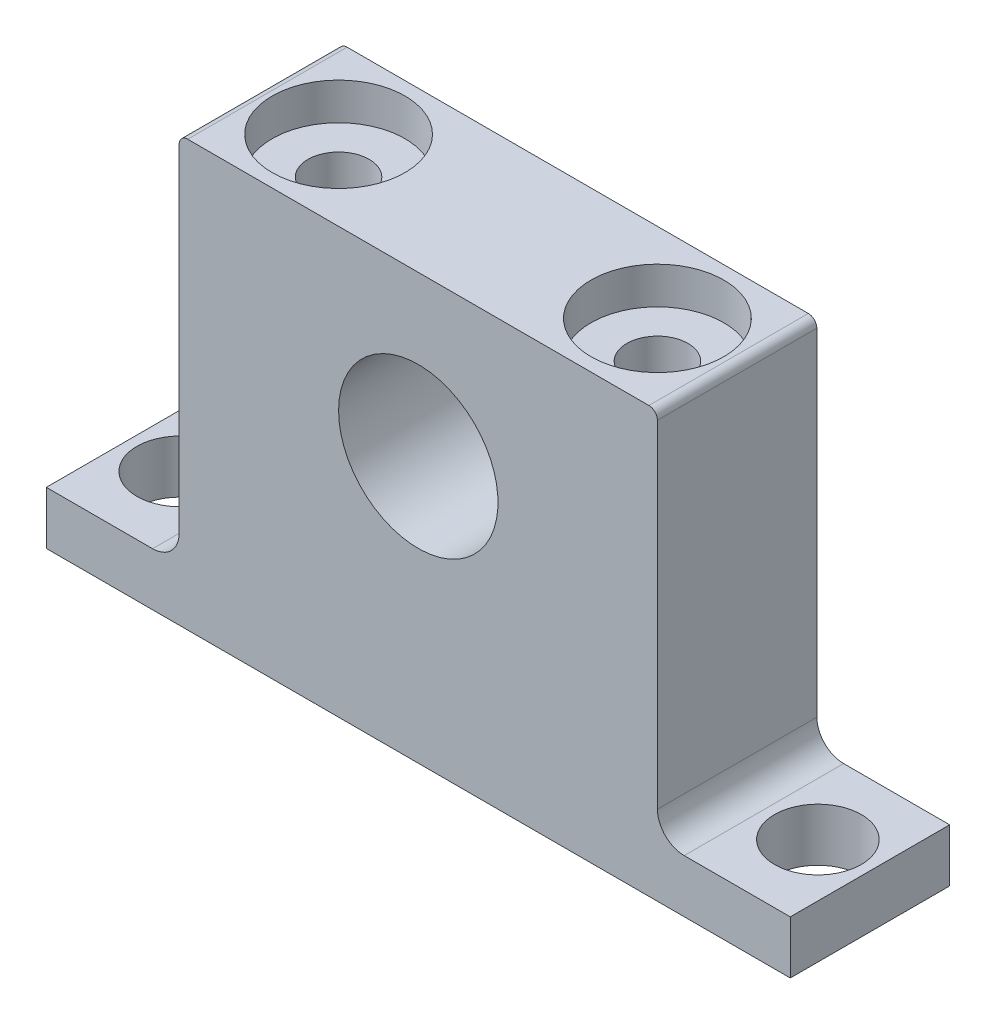
ISO-10303-21;
HEADER;
FILE_DESCRIPTION(('STEP AP214'),'2;1');
FILE_NAME('part.step','',(''),(''),'','','');
FILE_SCHEMA(('AUTOMOTIVE_DESIGN { 1 0 10303 214 1 1 1 1 }'));
ENDSEC;
DATA;
#1=APPLICATION_CONTEXT('core data for automotive mechanical design processes');
#2=APPLICATION_PROTOCOL_DEFINITION('international standard','automotive_design',2000,#1);
#3=PRODUCT_CONTEXT('',#1,'mechanical');
#4=PRODUCT('Part','Part','',(#3));
#5=PRODUCT_RELATED_PRODUCT_CATEGORY('part','',(#4));
#6=PRODUCT_DEFINITION_FORMATION('','',#4);
#7=PRODUCT_DEFINITION_CONTEXT('part definition',#1,'design');
#8=PRODUCT_DEFINITION('design','',#6,#7);
#9=PRODUCT_DEFINITION_SHAPE('','',#8);
#10=(LENGTH_UNIT() NAMED_UNIT(*) SI_UNIT(.MILLI.,.METRE.));
#11=(NAMED_UNIT(*) PLANE_ANGLE_UNIT() SI_UNIT($,.RADIAN.));
#12=(NAMED_UNIT(*) SI_UNIT($,.STERADIAN.) SOLID_ANGLE_UNIT());
#13=UNCERTAINTY_MEASURE_WITH_UNIT(LENGTH_MEASURE(1.E-05),#10,'distance_accuracy_value','');
#14=(GEOMETRIC_REPRESENTATION_CONTEXT(3) GLOBAL_UNCERTAINTY_ASSIGNED_CONTEXT((#13)) GLOBAL_UNIT_ASSIGNED_CONTEXT((#10,
#11,#12)) REPRESENTATION_CONTEXT('',''));
#15=CARTESIAN_POINT('',(0.,0.,0.));
#16=DIRECTION('',(0.,0.,1.));
#17=DIRECTION('',(1.,0.,0.));
#18=AXIS2_PLACEMENT_3D('',#15,#16,#17);
#19=CARTESIAN_POINT('',(-15.875,-7.94816958418083,9.525));
#20=DIRECTION('',(0.,0.,1.));
#21=DIRECTION('',(1.,0.,0.));
#22=AXIS2_PLACEMENT_3D('',#19,#20,#21);
#23=PLANE('',#22);
#24=CARTESIAN_POINT('',(-15.875,-7.94816958418083,9.525));
#25=DIRECTION('',(0.,0.,1.));
#26=DIRECTION('',(1.,0.,0.));
#27=AXIS2_PLACEMENT_3D('',#24,#25,#26);
#28=CIRCLE('',#27,1.5875);
#29=CARTESIAN_POINT('',(-15.875,-9.53566958418083,9.525));
#30=VERTEX_POINT('',#29);
#31=CARTESIAN_POINT('',(-14.2875,-7.94816958418082,9.525));
#32=VERTEX_POINT('',#31);
#33=EDGE_CURVE('E230',#30,#32,#28,.T.);
#34=ORIENTED_EDGE('',*,*,#33,.F.);
#35=DIRECTION('',(1.,0.,0.));
#36=VECTOR('',#35,1.);
#37=CARTESIAN_POINT('',(-22.225,-9.53566958418083,9.525));
#38=LINE('',#37,#36);
#39=CARTESIAN_POINT('',(-22.225,-9.53566958418083,9.525));
#40=VERTEX_POINT('',#39);
#41=EDGE_CURVE('E192',#40,#30,#38,.T.);
#42=ORIENTED_EDGE('',*,*,#41,.F.);
#43=DIRECTION('',(0.,1.,0.));
#44=VECTOR('',#43,1.);
#45=CARTESIAN_POINT('',(-22.225,-12.7,9.525));
#46=LINE('',#45,#44);
#47=CARTESIAN_POINT('',(-22.225,-12.7,9.525));
#48=VERTEX_POINT('',#47);
#49=EDGE_CURVE('E179',#48,#40,#46,.T.);
#50=ORIENTED_EDGE('',*,*,#49,.F.);
#51=DIRECTION('',(-1.,0.,0.));
#52=VECTOR('',#51,1.);
#53=CARTESIAN_POINT('',(22.225,-12.7,9.525));
#54=LINE('',#53,#52);
#55=CARTESIAN_POINT('',(22.225,-12.7,9.525));
#56=VERTEX_POINT('',#55);
#57=EDGE_CURVE('E191',#56,#48,#54,.T.);
#58=ORIENTED_EDGE('',*,*,#57,.F.);
#59=DIRECTION('',(0.,1.,0.));
#60=VECTOR('',#59,1.);
#61=CARTESIAN_POINT('',(22.225,-12.7,9.525));
#62=LINE('',#61,#60);
#63=CARTESIAN_POINT('',(22.225,-9.53566958418083,9.525));
#64=VERTEX_POINT('',#63);
#65=EDGE_CURVE('E196',#56,#64,#62,.T.);
#66=ORIENTED_EDGE('',*,*,#65,.T.);
#67=DIRECTION('',(-1.,0.,0.));
#68=VECTOR('',#67,1.);
#69=CARTESIAN_POINT('',(22.225,-9.53566958418083,9.525));
#70=LINE('',#69,#68);
#71=CARTESIAN_POINT('',(15.888767669028,-9.53566958418083,9.525));
#72=VERTEX_POINT('',#71);
#73=EDGE_CURVE('E198',#64,#72,#70,.T.);
#74=ORIENTED_EDGE('',*,*,#73,.T.);
#75=CARTESIAN_POINT('',(15.888767669028,-7.93440191515283,9.525));
#76=DIRECTION('',(0.,0.,-1.));
#77=DIRECTION('',(-1.,0.,0.));
#78=AXIS2_PLACEMENT_3D('',#75,#76,#77);
#79=CIRCLE('',#78,1.601267669028);
#80=CARTESIAN_POINT('',(14.2875,-7.93440191515282,9.525));
#81=VERTEX_POINT('',#80);
#82=EDGE_CURVE('E376',#72,#81,#79,.T.);
#83=ORIENTED_EDGE('',*,*,#82,.T.);
#84=DIRECTION('',(0.,1.,0.));
#85=VECTOR('',#84,1.);
#86=CARTESIAN_POINT('',(14.2875,3.175,9.525));
#87=LINE('',#86,#85);
#88=CARTESIAN_POINT('',(14.2875,12.192,9.525));
#89=VERTEX_POINT('',#88);
#90=EDGE_CURVE('E374',#81,#89,#87,.T.);
#91=ORIENTED_EDGE('',*,*,#90,.T.);
#92=CARTESIAN_POINT('',(13.7795,12.192,9.525));
#93=DIRECTION('',(0.,0.,1.));
#94=DIRECTION('',(1.,0.,0.));
#95=AXIS2_PLACEMENT_3D('',#92,#93,#94);
#96=CIRCLE('',#95,0.508);
#97=CARTESIAN_POINT('',(13.7795,12.7,9.525));
#98=VERTEX_POINT('',#97);
#99=EDGE_CURVE('E372',#89,#98,#96,.T.);
#100=ORIENTED_EDGE('',*,*,#99,.T.);
#101=DIRECTION('',(-1.,0.,0.));
#102=VECTOR('',#101,1.);
#103=CARTESIAN_POINT('',(13.7795,12.7,9.525));
#104=LINE('',#103,#102);
#105=CARTESIAN_POINT('',(-13.7795,12.7,9.525));
#106=VERTEX_POINT('',#105);
#107=EDGE_CURVE('E370',#98,#106,#104,.T.);
#108=ORIENTED_EDGE('',*,*,#107,.T.);
#109=CARTESIAN_POINT('',(-13.7795,12.192,9.525));
#110=DIRECTION('',(0.,0.,1.));
#111=DIRECTION('',(1.,0.,0.));
#112=AXIS2_PLACEMENT_3D('',#109,#110,#111);
#113=CIRCLE('',#112,0.508);
#114=CARTESIAN_POINT('',(-14.2875,12.192,9.525));
#115=VERTEX_POINT('',#114);
#116=EDGE_CURVE('E367',#106,#115,#113,.T.);
#117=ORIENTED_EDGE('',*,*,#116,.T.);
#118=DIRECTION('',(0.,1.,0.));
#119=VECTOR('',#118,1.);
#120=CARTESIAN_POINT('',(-14.2875,-7.94816958418082,9.525));
#121=LINE('',#120,#119);
#122=EDGE_CURVE('E365',#32,#115,#121,.T.);
#123=ORIENTED_EDGE('',*,*,#122,.F.);
#124=EDGE_LOOP('',(#34,#42,#50,#58,#66,#74,#83,#91,#100,#108,#117,#123));
#125=FACE_BOUND('',#124,.T.);
#126=CARTESIAN_POINT('',(0.,3.175,9.525));
#127=DIRECTION('',(0.,0.,1.));
#128=DIRECTION('',(1.,0.,0.));
#129=AXIS2_PLACEMENT_3D('',#126,#127,#128);
#130=CIRCLE('',#129,4.7625);
#131=CARTESIAN_POINT('',(-4.76250000000002,3.175,9.525));
#132=VERTEX_POINT('',#131);
#133=EDGE_CURVE('E207',#132,#132,#130,.T.);
#134=ORIENTED_EDGE('',*,*,#133,.F.);
#135=EDGE_LOOP('',(#134));
#136=FACE_BOUND('',#135,.T.);
#137=ADVANCED_FACE('F80',(#125,#136),#23,.T.);
#138=CARTESIAN_POINT('',(-15.875,-7.94816958418083,0.));
#139=DIRECTION('',(0.,0.,1.));
#140=DIRECTION('',(1.,0.,0.));
#141=AXIS2_PLACEMENT_3D('',#138,#139,#140);
#142=PLANE('',#141);
#143=CARTESIAN_POINT('',(-15.875,-7.94816958418083,0.));
#144=DIRECTION('',(0.,0.,1.));
#145=DIRECTION('',(1.,0.,0.));
#146=AXIS2_PLACEMENT_3D('',#143,#144,#145);
#147=CIRCLE('',#146,1.5875);
#148=CARTESIAN_POINT('',(-15.875,-9.53566958418083,0.));
#149=VERTEX_POINT('',#148);
#150=CARTESIAN_POINT('',(-14.2875,-7.94816958418082,0.));
#151=VERTEX_POINT('',#150);
#152=EDGE_CURVE('E203',#149,#151,#147,.T.);
#153=ORIENTED_EDGE('',*,*,#152,.T.);
#154=DIRECTION('',(0.,1.,0.));
#155=VECTOR('',#154,1.);
#156=CARTESIAN_POINT('',(-14.2875,3.175,0.));
#157=LINE('',#156,#155);
#158=CARTESIAN_POINT('',(-14.2875,12.192,0.));
#159=VERTEX_POINT('',#158);
#160=EDGE_CURVE('E206',#151,#159,#157,.T.);
#161=ORIENTED_EDGE('',*,*,#160,.T.);
#162=CARTESIAN_POINT('',(-13.7795,12.192,0.));
#163=DIRECTION('',(0.,0.,1.));
#164=DIRECTION('',(1.,0.,0.));
#165=AXIS2_PLACEMENT_3D('',#162,#163,#164);
#166=CIRCLE('',#165,0.508);
#167=CARTESIAN_POINT('',(-13.7795,12.7,0.));
#168=VERTEX_POINT('',#167);
#169=EDGE_CURVE('E210',#168,#159,#166,.T.);
#170=ORIENTED_EDGE('',*,*,#169,.F.);
#171=DIRECTION('',(-1.,0.,0.));
#172=VECTOR('',#171,1.);
#173=CARTESIAN_POINT('',(13.7795,12.7,0.));
#174=LINE('',#173,#172);
#175=CARTESIAN_POINT('',(13.7795,12.7,0.));
#176=VERTEX_POINT('',#175);
#177=EDGE_CURVE('E213',#176,#168,#174,.T.);
#178=ORIENTED_EDGE('',*,*,#177,.F.);
#179=CARTESIAN_POINT('',(13.7795,12.192,0.));
#180=DIRECTION('',(0.,0.,1.));
#181=DIRECTION('',(1.,0.,0.));
#182=AXIS2_PLACEMENT_3D('',#179,#180,#181);
#183=CIRCLE('',#182,0.508);
#184=CARTESIAN_POINT('',(14.2875,12.192,0.));
#185=VERTEX_POINT('',#184);
#186=EDGE_CURVE('E215',#185,#176,#183,.T.);
#187=ORIENTED_EDGE('',*,*,#186,.F.);
#188=DIRECTION('',(0.,1.,0.));
#189=VECTOR('',#188,1.);
#190=CARTESIAN_POINT('',(14.2875,-7.93440191515282,0.));
#191=LINE('',#190,#189);
#192=CARTESIAN_POINT('',(14.2875,-7.93440191515282,0.));
#193=VERTEX_POINT('',#192);
#194=EDGE_CURVE('E217',#193,#185,#191,.T.);
#195=ORIENTED_EDGE('',*,*,#194,.F.);
#196=CARTESIAN_POINT('',(15.888767669028,-7.93440191515283,0.));
#197=DIRECTION('',(0.,0.,-1.));
#198=DIRECTION('',(-1.,0.,0.));
#199=AXIS2_PLACEMENT_3D('',#196,#197,#198);
#200=CIRCLE('',#199,1.601267669028);
#201=CARTESIAN_POINT('',(15.888767669028,-9.53566958418083,0.));
#202=VERTEX_POINT('',#201);
#203=EDGE_CURVE('E219',#202,#193,#200,.T.);
#204=ORIENTED_EDGE('',*,*,#203,.F.);
#205=DIRECTION('',(-1.,0.,0.));
#206=VECTOR('',#205,1.);
#207=CARTESIAN_POINT('',(22.225,-9.53566958418083,0.));
#208=LINE('',#207,#206);
#209=CARTESIAN_POINT('',(22.225,-9.53566958418083,0.));
#210=VERTEX_POINT('',#209);
#211=EDGE_CURVE('E221',#210,#202,#208,.T.);
#212=ORIENTED_EDGE('',*,*,#211,.F.);
#213=DIRECTION('',(0.,1.,0.));
#214=VECTOR('',#213,1.);
#215=CARTESIAN_POINT('',(22.225,-12.7,0.));
#216=LINE('',#215,#214);
#217=CARTESIAN_POINT('',(22.225,-12.7,0.));
#218=VERTEX_POINT('',#217);
#219=EDGE_CURVE('E223',#218,#210,#216,.T.);
#220=ORIENTED_EDGE('',*,*,#219,.F.);
#221=DIRECTION('',(-1.,0.,0.));
#222=VECTOR('',#221,1.);
#223=CARTESIAN_POINT('',(22.225,-12.7,0.));
#224=LINE('',#223,#222);
#225=CARTESIAN_POINT('',(-22.225,-12.7,0.));
#226=VERTEX_POINT('',#225);
#227=EDGE_CURVE('E225',#218,#226,#224,.T.);
#228=ORIENTED_EDGE('',*,*,#227,.T.);
#229=DIRECTION('',(0.,1.,0.));
#230=VECTOR('',#229,1.);
#231=CARTESIAN_POINT('',(-22.225,-12.7,0.));
#232=LINE('',#231,#230);
#233=CARTESIAN_POINT('',(-22.225,-9.53566958418083,0.));
#234=VERTEX_POINT('',#233);
#235=EDGE_CURVE('E181',#226,#234,#232,.T.);
#236=ORIENTED_EDGE('',*,*,#235,.T.);
#237=DIRECTION('',(1.,0.,0.));
#238=VECTOR('',#237,1.);
#239=CARTESIAN_POINT('',(-22.225,-9.53566958418083,0.));
#240=LINE('',#239,#238);
#241=EDGE_CURVE('E228',#234,#149,#240,.T.);
#242=ORIENTED_EDGE('',*,*,#241,.T.);
#243=EDGE_LOOP('',(#153,#161,#170,#178,#187,#195,#204,#212,#220,#228,#236,#242));
#244=FACE_BOUND('',#243,.T.);
#245=CARTESIAN_POINT('',(0.,3.175,0.));
#246=DIRECTION('',(0.,0.,1.));
#247=DIRECTION('',(1.,0.,0.));
#248=AXIS2_PLACEMENT_3D('',#245,#246,#247);
#249=CIRCLE('',#248,4.7625);
#250=CARTESIAN_POINT('',(-4.76250000000002,3.175,0.));
#251=VERTEX_POINT('',#250);
#252=EDGE_CURVE('E359',#251,#251,#249,.T.);
#253=ORIENTED_EDGE('',*,*,#252,.T.);
#254=EDGE_LOOP('',(#253));
#255=FACE_BOUND('',#254,.T.);
#256=ADVANCED_FACE('F254',(#244,#255),#142,.F.);
#257=CARTESIAN_POINT('',(-15.875,-7.94816958418083,9.525));
#258=DIRECTION('',(0.,0.,-1.));
#259=DIRECTION('',(-1.,0.,0.));
#260=AXIS2_PLACEMENT_3D('',#257,#258,#259);
#261=CYLINDRICAL_SURFACE('',#260,1.5875);
#262=ORIENTED_EDGE('',*,*,#152,.F.);
#263=DIRECTION('',(0.,0.,-1.));
#264=VECTOR('',#263,1.);
#265=CARTESIAN_POINT('',(-15.875,-9.53566958418083,9.525));
#266=LINE('',#265,#264);
#267=EDGE_CURVE('E12',#30,#149,#266,.T.);
#268=ORIENTED_EDGE('',*,*,#267,.F.);
#269=ORIENTED_EDGE('',*,*,#33,.T.);
#270=DIRECTION('',(0.,0.,-1.));
#271=VECTOR('',#270,1.);
#272=CARTESIAN_POINT('',(-14.2875,-7.94816958418082,9.525));
#273=LINE('',#272,#271);
#274=EDGE_CURVE('E84',#32,#151,#273,.T.);
#275=ORIENTED_EDGE('',*,*,#274,.T.);
#276=EDGE_LOOP('',(#262,#268,#269,#275));
#277=FACE_BOUND('',#276,.T.);
#278=ADVANCED_FACE('F82',(#277),#261,.F.);
#279=CARTESIAN_POINT('',(-22.225,-9.53566958418083,9.525));
#280=DIRECTION('',(0.,1.,0.));
#281=DIRECTION('',(0.,0.,1.));
#282=AXIS2_PLACEMENT_3D('',#279,#280,#281);
#283=PLANE('',#282);
#284=CARTESIAN_POINT('',(-19.05,-9.53566958418083,4.69901813767502));
#285=DIRECTION('',(0.,1.,0.));
#286=DIRECTION('',(0.,0.,1.));
#287=AXIS2_PLACEMENT_3D('',#284,#285,#286);
#288=CIRCLE('',#287,2.59079999999999);
#289=CARTESIAN_POINT('',(-19.05,-9.53566958418083,7.289818137675));
#290=VERTEX_POINT('',#289);
#291=EDGE_CURVE('E325',#290,#290,#288,.T.);
#292=ORIENTED_EDGE('',*,*,#291,.F.);
#293=EDGE_LOOP('',(#292));
#294=FACE_BOUND('',#293,.T.);
#295=ORIENTED_EDGE('',*,*,#241,.F.);
#296=DIRECTION('',(0.,0.,-1.));
#297=VECTOR('',#296,1.);
#298=CARTESIAN_POINT('',(-22.225,-9.53566958418083,9.525));
#299=LINE('',#298,#297);
#300=EDGE_CURVE('E90',#40,#234,#299,.T.);
#301=ORIENTED_EDGE('',*,*,#300,.F.);
#302=ORIENTED_EDGE('',*,*,#41,.T.);
#303=ORIENTED_EDGE('',*,*,#267,.T.);
#304=EDGE_LOOP('',(#295,#301,#302,#303));
#305=FACE_BOUND('',#304,.T.);
#306=ADVANCED_FACE('F257',(#294,#305),#283,.T.);
#307=CARTESIAN_POINT('',(-22.225,-12.7,9.525));
#308=DIRECTION('',(-1.,0.,0.));
#309=DIRECTION('',(0.,0.,1.));
#310=AXIS2_PLACEMENT_3D('',#307,#308,#309);
#311=PLANE('',#310);
#312=ORIENTED_EDGE('',*,*,#235,.F.);
#313=DIRECTION('',(0.,0.,-1.));
#314=VECTOR('',#313,1.);
#315=CARTESIAN_POINT('',(-22.225,-12.7,9.525));
#316=LINE('',#315,#314);
#317=EDGE_CURVE('E176',#48,#226,#316,.T.);
#318=ORIENTED_EDGE('',*,*,#317,.F.);
#319=ORIENTED_EDGE('',*,*,#49,.T.);
#320=ORIENTED_EDGE('',*,*,#300,.T.);
#321=EDGE_LOOP('',(#312,#318,#319,#320));
#322=FACE_BOUND('',#321,.T.);
#323=ADVANCED_FACE('F178',(#322),#311,.T.);
#324=CARTESIAN_POINT('',(22.225,-12.7,9.525));
#325=DIRECTION('',(0.,-1.,0.));
#326=DIRECTION('',(1.,0.,0.));
#327=AXIS2_PLACEMENT_3D('',#324,#325,#326);
#328=PLANE('',#327);
#329=CARTESIAN_POINT('',(-19.05,-12.7,4.69901813767502));
#330=DIRECTION('',(0.,1.,0.));
#331=DIRECTION('',(0.,0.,1.));
#332=AXIS2_PLACEMENT_3D('',#329,#330,#331);
#333=CIRCLE('',#332,2.5908);
#334=CARTESIAN_POINT('',(-19.05,-12.7,7.28981813767501));
#335=VERTEX_POINT('',#334);
#336=EDGE_CURVE('E323',#335,#335,#333,.T.);
#337=ORIENTED_EDGE('',*,*,#336,.T.);
#338=EDGE_LOOP('',(#337));
#339=FACE_BOUND('',#338,.T.);
#340=CARTESIAN_POINT('',(19.05,-12.7,4.69901813767502));
#341=DIRECTION('',(0.,1.,0.));
#342=DIRECTION('',(0.,0.,1.));
#343=AXIS2_PLACEMENT_3D('',#340,#341,#342);
#344=CIRCLE('',#343,2.5908);
#345=CARTESIAN_POINT('',(19.05,-12.7,7.28981813767501));
#346=VERTEX_POINT('',#345);
#347=EDGE_CURVE('E332',#346,#346,#344,.T.);
#348=ORIENTED_EDGE('',*,*,#347,.T.);
#349=EDGE_LOOP('',(#348));
#350=FACE_BOUND('',#349,.T.);
#351=ORIENTED_EDGE('',*,*,#227,.F.);
#352=DIRECTION('',(0.,0.,-1.));
#353=VECTOR('',#352,1.);
#354=CARTESIAN_POINT('',(22.225,-12.7,9.525));
#355=LINE('',#354,#353);
#356=EDGE_CURVE('E186',#56,#218,#355,.T.);
#357=ORIENTED_EDGE('',*,*,#356,.F.);
#358=ORIENTED_EDGE('',*,*,#57,.T.);
#359=ORIENTED_EDGE('',*,*,#317,.T.);
#360=EDGE_LOOP('',(#351,#357,#358,#359));
#361=FACE_BOUND('',#360,.T.);
#362=ADVANCED_FACE('F194',(#339,#350,#361),#328,.T.);
#363=CARTESIAN_POINT('',(22.225,-12.7,9.525));
#364=DIRECTION('',(-1.,0.,0.));
#365=DIRECTION('',(0.,0.,1.));
#366=AXIS2_PLACEMENT_3D('',#363,#364,#365);
#367=PLANE('',#366);
#368=ORIENTED_EDGE('',*,*,#219,.T.);
#369=DIRECTION('',(0.,0.,-1.));
#370=VECTOR('',#369,1.);
#371=CARTESIAN_POINT('',(22.225,-9.53566958418083,9.525));
#372=LINE('',#371,#370);
#373=EDGE_CURVE('E234',#64,#210,#372,.T.);
#374=ORIENTED_EDGE('',*,*,#373,.F.);
#375=ORIENTED_EDGE('',*,*,#65,.F.);
#376=ORIENTED_EDGE('',*,*,#356,.T.);
#377=EDGE_LOOP('',(#368,#374,#375,#376));
#378=FACE_BOUND('',#377,.T.);
#379=ADVANCED_FACE('F423',(#378),#367,.F.);
#380=CARTESIAN_POINT('',(22.225,-9.53566958418083,9.525));
#381=DIRECTION('',(0.,-1.,0.));
#382=DIRECTION('',(0.,0.,-1.));
#383=AXIS2_PLACEMENT_3D('',#380,#381,#382);
#384=PLANE('',#383);
#385=CARTESIAN_POINT('',(19.05,-9.53566958418083,4.69901813767502));
#386=DIRECTION('',(0.,1.,0.));
#387=DIRECTION('',(0.,0.,1.));
#388=AXIS2_PLACEMENT_3D('',#385,#386,#387);
#389=CIRCLE('',#388,2.59079999999999);
#390=CARTESIAN_POINT('',(19.05,-9.53566958418083,7.289818137675));
#391=VERTEX_POINT('',#390);
#392=EDGE_CURVE('E327',#391,#391,#389,.T.);
#393=ORIENTED_EDGE('',*,*,#392,.F.);
#394=EDGE_LOOP('',(#393));
#395=FACE_BOUND('',#394,.T.);
#396=ORIENTED_EDGE('',*,*,#211,.T.);
#397=DIRECTION('',(0.,0.,-1.));
#398=VECTOR('',#397,1.);
#399=CARTESIAN_POINT('',(15.888767669028,-9.53566958418083,9.525));
#400=LINE('',#399,#398);
#401=EDGE_CURVE('E237',#72,#202,#400,.T.);
#402=ORIENTED_EDGE('',*,*,#401,.F.);
#403=ORIENTED_EDGE('',*,*,#73,.F.);
#404=ORIENTED_EDGE('',*,*,#373,.T.);
#405=EDGE_LOOP('',(#396,#402,#403,#404));
#406=FACE_BOUND('',#405,.T.);
#407=ADVANCED_FACE('F384',(#395,#406),#384,.F.);
#408=CARTESIAN_POINT('',(15.888767669028,-7.93440191515283,9.525));
#409=DIRECTION('',(0.,0.,-1.));
#410=DIRECTION('',(-1.,0.,0.));
#411=AXIS2_PLACEMENT_3D('',#408,#409,#410);
#412=CYLINDRICAL_SURFACE('',#411,1.601267669028);
#413=ORIENTED_EDGE('',*,*,#203,.T.);
#414=DIRECTION('',(0.,0.,-1.));
#415=VECTOR('',#414,1.);
#416=CARTESIAN_POINT('',(14.2875,-7.93440191515282,9.525));
#417=LINE('',#416,#415);
#418=EDGE_CURVE('E240',#81,#193,#417,.T.);
#419=ORIENTED_EDGE('',*,*,#418,.F.);
#420=ORIENTED_EDGE('',*,*,#82,.F.);
#421=ORIENTED_EDGE('',*,*,#401,.T.);
#422=EDGE_LOOP('',(#413,#419,#420,#421));
#423=FACE_BOUND('',#422,.T.);
#424=ADVANCED_FACE('F388',(#423),#412,.F.);
#425=CARTESIAN_POINT('',(14.2875,-7.93440191515282,9.525));
#426=DIRECTION('',(-1.,0.,0.));
#427=DIRECTION('',(0.,0.,1.));
#428=AXIS2_PLACEMENT_3D('',#425,#426,#427);
#429=PLANE('',#428);
#430=ORIENTED_EDGE('',*,*,#194,.T.);
#431=DIRECTION('',(0.,0.,-1.));
#432=VECTOR('',#431,1.);
#433=CARTESIAN_POINT('',(14.2875,12.192,9.525));
#434=LINE('',#433,#432);
#435=EDGE_CURVE('E243',#89,#185,#434,.T.);
#436=ORIENTED_EDGE('',*,*,#435,.F.);
#437=ORIENTED_EDGE('',*,*,#90,.F.);
#438=ORIENTED_EDGE('',*,*,#418,.T.);
#439=EDGE_LOOP('',(#430,#436,#437,#438));
#440=FACE_BOUND('',#439,.T.);
#441=ADVANCED_FACE('F391',(#440),#429,.F.);
#442=CARTESIAN_POINT('',(13.7795,12.192,9.525));
#443=DIRECTION('',(0.,0.,-1.));
#444=DIRECTION('',(-1.,0.,0.));
#445=AXIS2_PLACEMENT_3D('',#442,#443,#444);
#446=CYLINDRICAL_SURFACE('',#445,0.508);
#447=ORIENTED_EDGE('',*,*,#186,.T.);
#448=DIRECTION('',(0.,0.,-1.));
#449=VECTOR('',#448,1.);
#450=CARTESIAN_POINT('',(13.7795,12.7,9.525));
#451=LINE('',#450,#449);
#452=EDGE_CURVE('E246',#98,#176,#451,.T.);
#453=ORIENTED_EDGE('',*,*,#452,.F.);
#454=ORIENTED_EDGE('',*,*,#99,.F.);
#455=ORIENTED_EDGE('',*,*,#435,.T.);
#456=EDGE_LOOP('',(#447,#453,#454,#455));
#457=FACE_BOUND('',#456,.T.);
#458=ADVANCED_FACE('F397',(#457),#446,.T.);
#459=CARTESIAN_POINT('',(13.7795,12.7,9.525));
#460=DIRECTION('',(0.,-1.,0.));
#461=DIRECTION('',(0.,0.,-1.));
#462=AXIS2_PLACEMENT_3D('',#459,#460,#461);
#463=PLANE('',#462);
#464=CARTESIAN_POINT('',(9.525,12.7,4.7625));
#465=DIRECTION('',(0.,1.,0.));
#466=DIRECTION('',(0.,0.,1.));
#467=AXIS2_PLACEMENT_3D('',#464,#465,#466);
#468=CIRCLE('',#467,3.96875);
#469=CARTESIAN_POINT('',(9.525,12.7,8.73125));
#470=VERTEX_POINT('',#469);
#471=EDGE_CURVE('E335',#470,#470,#468,.T.);
#472=ORIENTED_EDGE('',*,*,#471,.F.);
#473=EDGE_LOOP('',(#472));
#474=FACE_BOUND('',#473,.T.);
#475=CARTESIAN_POINT('',(-9.52500000000001,12.7,4.7625));
#476=DIRECTION('',(0.,1.,0.));
#477=DIRECTION('',(0.,0.,1.));
#478=AXIS2_PLACEMENT_3D('',#475,#476,#477);
#479=CIRCLE('',#478,3.96875);
#480=CARTESIAN_POINT('',(-9.52500000000001,12.7,8.73125));
#481=VERTEX_POINT('',#480);
#482=EDGE_CURVE('E347',#481,#481,#479,.T.);
#483=ORIENTED_EDGE('',*,*,#482,.F.);
#484=EDGE_LOOP('',(#483));
#485=FACE_BOUND('',#484,.T.);
#486=ORIENTED_EDGE('',*,*,#177,.T.);
#487=DIRECTION('',(0.,0.,-1.));
#488=VECTOR('',#487,1.);
#489=CARTESIAN_POINT('',(-13.7795,12.7,9.525));
#490=LINE('',#489,#488);
#491=EDGE_CURVE('E249',#106,#168,#490,.T.);
#492=ORIENTED_EDGE('',*,*,#491,.F.);
#493=ORIENTED_EDGE('',*,*,#107,.F.);
#494=ORIENTED_EDGE('',*,*,#452,.T.);
#495=EDGE_LOOP('',(#486,#492,#493,#494));
#496=FACE_BOUND('',#495,.T.);
#497=ADVANCED_FACE('F401',(#474,#485,#496),#463,.F.);
#498=CARTESIAN_POINT('',(-13.7795,12.192,9.525));
#499=DIRECTION('',(0.,0.,-1.));
#500=DIRECTION('',(-1.,0.,0.));
#501=AXIS2_PLACEMENT_3D('',#498,#499,#500);
#502=CYLINDRICAL_SURFACE('',#501,0.508);
#503=ORIENTED_EDGE('',*,*,#169,.T.);
#504=DIRECTION('',(0.,0.,-1.));
#505=VECTOR('',#504,1.);
#506=CARTESIAN_POINT('',(-14.2875,12.192,9.525));
#507=LINE('',#506,#505);
#508=EDGE_CURVE('E251',#115,#159,#507,.T.);
#509=ORIENTED_EDGE('',*,*,#508,.F.);
#510=ORIENTED_EDGE('',*,*,#116,.F.);
#511=ORIENTED_EDGE('',*,*,#491,.T.);
#512=EDGE_LOOP('',(#503,#509,#510,#511));
#513=FACE_BOUND('',#512,.T.);
#514=ADVANCED_FACE('F405',(#513),#502,.T.);
#515=CARTESIAN_POINT('',(-14.2875,3.175,9.525));
#516=DIRECTION('',(-1.,0.,0.));
#517=DIRECTION('',(0.,0.,1.));
#518=AXIS2_PLACEMENT_3D('',#515,#516,#517);
#519=PLANE('',#518);
#520=ORIENTED_EDGE('',*,*,#160,.F.);
#521=ORIENTED_EDGE('',*,*,#274,.F.);
#522=ORIENTED_EDGE('',*,*,#122,.T.);
#523=ORIENTED_EDGE('',*,*,#508,.T.);
#524=EDGE_LOOP('',(#520,#521,#522,#523));
#525=FACE_BOUND('',#524,.T.);
#526=ADVANCED_FACE('F278',(#525),#519,.T.);
#527=CARTESIAN_POINT('',(0.,3.175,9.525));
#528=DIRECTION('',(0.,0.,-1.));
#529=DIRECTION('',(-1.,0.,0.));
#530=AXIS2_PLACEMENT_3D('',#527,#528,#529);
#531=CYLINDRICAL_SURFACE('',#530,4.7625);
#532=CARTESIAN_POINT('',(-4.76250000000002,3.175,9.525));
#533=CARTESIAN_POINT('',(-4.76250000000002,3.175,9.42578125));
#534=CARTESIAN_POINT('',(-4.76250000000002,3.175,9.3265625));
#535=CARTESIAN_POINT('',(-4.76250000000002,3.175,9.128125));
#536=CARTESIAN_POINT('',(-4.76250000000002,3.175,9.02890625));
#537=CARTESIAN_POINT('',(-4.76250000000002,3.175,8.83046875));
#538=CARTESIAN_POINT('',(-4.76250000000002,3.175,8.73125));
#539=CARTESIAN_POINT('',(-4.76250000000002,3.175,8.5328125));
#540=CARTESIAN_POINT('',(-4.76250000000002,3.175,8.43359375));
#541=CARTESIAN_POINT('',(-4.76250000000002,3.175,8.23515625));
#542=CARTESIAN_POINT('',(-4.76250000000002,3.175,8.1359375));
#543=CARTESIAN_POINT('',(-4.76250000000002,3.175,7.9375));
#544=CARTESIAN_POINT('',(-4.76250000000002,3.175,7.83828125));
#545=CARTESIAN_POINT('',(-4.76250000000002,3.175,7.63984375));
#546=CARTESIAN_POINT('',(-4.76250000000002,3.175,7.540625));
#547=CARTESIAN_POINT('',(-4.76250000000002,3.175,7.3421875));
#548=CARTESIAN_POINT('',(-4.76250000000002,3.175,7.24296875));
#549=CARTESIAN_POINT('',(-4.76250000000002,3.175,7.04453125));
#550=CARTESIAN_POINT('',(-4.76250000000002,3.175,6.9453125));
#551=CARTESIAN_POINT('',(-4.76250000000002,3.175,6.746875));
#552=CARTESIAN_POINT('',(-4.76250000000002,3.175,6.64765625));
#553=CARTESIAN_POINT('',(-4.76250000000002,3.175,6.44921875));
#554=CARTESIAN_POINT('',(-4.76250000000002,3.175,6.35));
#555=CARTESIAN_POINT('',(-4.76250000000002,3.175,6.1515625));
#556=CARTESIAN_POINT('',(-4.76250000000002,3.175,6.05234375));
#557=CARTESIAN_POINT('',(-4.76250000000002,3.175,5.85390625));
#558=CARTESIAN_POINT('',(-4.76250000000002,3.175,5.7546875));
#559=CARTESIAN_POINT('',(-4.76250000000002,3.175,5.55625));
#560=CARTESIAN_POINT('',(-4.76250000000002,3.175,5.45703125));
#561=CARTESIAN_POINT('',(-4.76250000000002,3.175,5.25859375));
#562=CARTESIAN_POINT('',(-4.76250000000002,3.175,5.159375));
#563=CARTESIAN_POINT('',(-4.76250000000002,3.175,4.9609375));
#564=CARTESIAN_POINT('',(-4.76250000000002,3.175,4.86171875));
#565=CARTESIAN_POINT('',(-4.76250000000002,3.175,4.66328125));
#566=CARTESIAN_POINT('',(-4.76250000000002,3.175,4.5640625));
#567=CARTESIAN_POINT('',(-4.76250000000002,3.175,4.365625));
#568=CARTESIAN_POINT('',(-4.76250000000002,3.175,4.26640625));
#569=CARTESIAN_POINT('',(-4.76250000000002,3.175,4.06796875));
#570=CARTESIAN_POINT('',(-4.76250000000002,3.175,3.96875));
#571=CARTESIAN_POINT('',(-4.76250000000002,3.175,3.7703125));
#572=CARTESIAN_POINT('',(-4.76250000000002,3.175,3.67109375));
#573=CARTESIAN_POINT('',(-4.76250000000002,3.175,3.47265625));
#574=CARTESIAN_POINT('',(-4.76250000000002,3.175,3.3734375));
#575=CARTESIAN_POINT('',(-4.76250000000002,3.175,3.175));
#576=CARTESIAN_POINT('',(-4.76250000000002,3.175,3.07578125));
#577=CARTESIAN_POINT('',(-4.76250000000002,3.175,2.87734375));
#578=CARTESIAN_POINT('',(-4.76250000000002,3.175,2.778125));
#579=CARTESIAN_POINT('',(-4.76250000000002,3.175,2.5796875));
#580=CARTESIAN_POINT('',(-4.76250000000002,3.175,2.48046875));
#581=CARTESIAN_POINT('',(-4.76250000000002,3.175,2.28203125));
#582=CARTESIAN_POINT('',(-4.76250000000002,3.175,2.1828125));
#583=CARTESIAN_POINT('',(-4.76250000000002,3.175,1.984375));
#584=CARTESIAN_POINT('',(-4.76250000000002,3.175,1.88515625));
#585=CARTESIAN_POINT('',(-4.76250000000002,3.175,1.68671875));
#586=CARTESIAN_POINT('',(-4.76250000000002,3.175,1.5875));
#587=CARTESIAN_POINT('',(-4.76250000000002,3.175,1.3890625));
#588=CARTESIAN_POINT('',(-4.76250000000002,3.175,1.28984375));
#589=CARTESIAN_POINT('',(-4.76250000000002,3.175,1.09140625));
#590=CARTESIAN_POINT('',(-4.76250000000002,3.175,0.992187500000001));
#591=CARTESIAN_POINT('',(-4.76250000000002,3.175,0.793750000000001));
#592=CARTESIAN_POINT('',(-4.76250000000002,3.175,0.69453125));
#593=CARTESIAN_POINT('',(-4.76250000000002,3.175,0.49609375));
#594=CARTESIAN_POINT('',(-4.76250000000002,3.175,0.396875));
#595=CARTESIAN_POINT('',(-4.76250000000002,3.175,0.1984375));
#596=CARTESIAN_POINT('',(-4.76250000000002,3.175,0.0992187500000001));
#597=CARTESIAN_POINT('',(-4.76250000000002,3.175,0.));
#598=B_SPLINE_CURVE_WITH_KNOTS('',3,(#532,#533,#534,#535,#536,#537,#538,#539,#540,#541,#542,
#543,#544,#545,#546,#547,#548,#549,#550,#551,#552,#553,#554,#555,#556,#557,#558,#559,#560,#561,
#562,#563,#564,#565,#566,#567,#568,#569,#570,#571,#572,#573,#574,#575,#576,#577,#578,#579,#580,
#581,#582,#583,#584,#585,#586,#587,#588,#589,#590,#591,#592,#593,#594,#595,#596,#597),
.UNSPECIFIED.,.F.,.F.,(4,2,2,2,2,2,2,2,2,2,2,2,2,2,2,2,2,2,2,2,2,2,2,2,2,2,2,2,2,2,2,2,4),(0.,
0.29765625,0.5953125,0.892968750000001,1.190625,1.48828125,1.7859375,2.08359375,2.38125,
2.67890625,2.9765625,3.27421875,3.571875,3.86953125,4.1671875,4.46484375,4.7625,5.06015625,
5.3578125,5.65546875,5.953125,6.25078125,6.5484375,6.84609375,7.14375,7.44140625,7.7390625,
8.03671875,8.334375,8.63203125,8.9296875,9.22734375,9.525),.UNSPECIFIED.);
#599=EDGE_CURVE('BSEAM274',#132,#251,#598,.T.);
#600=ORIENTED_EDGE('',*,*,#133,.T.);
#601=ORIENTED_EDGE('',*,*,#252,.F.);
#602=ORIENTED_EDGE('',*,*,#599,.T.);
#603=ORIENTED_EDGE('',*,*,#599,.F.);
#604=EDGE_LOOP('',(#600,#602,#601,#603));
#605=FACE_BOUND('',#604,.T.);
#606=ADVANCED_FACE('F274',(#605),#531,.F.);
#607=CARTESIAN_POINT('',(-9.52500000000001,-1.524,4.7625));
#608=DIRECTION('',(0.,1.,0.));
#609=DIRECTION('',(0.,0.,1.));
#610=AXIS2_PLACEMENT_3D('',#607,#608,#609);
#611=CONICAL_SURFACE('',#610,1.8288,1.02974425867665);
#612=CARTESIAN_POINT('',(-9.52500000000001,-2.62285390007761,4.7625));
#613=VERTEX_POINT('',#612);
#614=VERTEX_LOOP('',#613);
#615=FACE_BOUND('',#614,.T.);
#616=CARTESIAN_POINT('',(-9.52500000000001,-1.524,4.7625));
#617=DIRECTION('',(0.,1.,0.));
#618=DIRECTION('',(0.,0.,1.));
#619=AXIS2_PLACEMENT_3D('',#616,#617,#618);
#620=CIRCLE('',#619,1.8288);
#621=CARTESIAN_POINT('',(-9.52500000000001,-1.524,6.5913));
#622=VERTEX_POINT('',#621);
#623=EDGE_CURVE('E356',#622,#622,#620,.T.);
#624=ORIENTED_EDGE('',*,*,#623,.T.);
#625=EDGE_LOOP('',(#624));
#626=FACE_BOUND('',#625,.T.);
#627=ADVANCED_FACE('F277',(#615,#626),#611,.F.);
#628=CARTESIAN_POINT('',(-9.52500000000001,12.7,4.7625));
#629=DIRECTION('',(0.,1.,0.));
#630=DIRECTION('',(0.,0.,1.));
#631=AXIS2_PLACEMENT_3D('',#628,#629,#630);
#632=CYLINDRICAL_SURFACE('',#631,1.8288);
#633=ORIENTED_EDGE('',*,*,#623,.F.);
#634=EDGE_LOOP('',(#633));
#635=FACE_BOUND('',#634,.T.);
#636=CARTESIAN_POINT('',(-9.52500000000001,10.4902,4.7625));
#637=DIRECTION('',(0.,1.,0.));
#638=DIRECTION('',(0.,0.,1.));
#639=AXIS2_PLACEMENT_3D('',#636,#637,#638);
#640=CIRCLE('',#639,1.8288);
#641=CARTESIAN_POINT('',(-9.52500000000001,10.4902,6.5913));
#642=VERTEX_POINT('',#641);
#643=EDGE_CURVE('E353',#642,#642,#640,.T.);
#644=ORIENTED_EDGE('',*,*,#643,.T.);
#645=EDGE_LOOP('',(#644));
#646=FACE_BOUND('',#645,.T.);
#647=ADVANCED_FACE('F282',(#635,#646),#632,.F.);
#648=CARTESIAN_POINT('',(-7.69620000000001,10.4902,4.7625));
#649=DIRECTION('',(0.,-1.,0.));
#650=DIRECTION('',(0.,0.,-1.));
#651=AXIS2_PLACEMENT_3D('',#648,#649,#650);
#652=PLANE('',#651);
#653=ORIENTED_EDGE('',*,*,#643,.F.);
#654=EDGE_LOOP('',(#653));
#655=FACE_BOUND('',#654,.T.);
#656=CARTESIAN_POINT('',(-9.52500000000001,10.4902,4.7625));
#657=DIRECTION('',(0.,1.,0.));
#658=DIRECTION('',(0.,0.,1.));
#659=AXIS2_PLACEMENT_3D('',#656,#657,#658);
#660=CIRCLE('',#659,3.96875);
#661=CARTESIAN_POINT('',(-9.52500000000001,10.4902,8.73125));
#662=VERTEX_POINT('',#661);
#663=EDGE_CURVE('E350',#662,#662,#660,.T.);
#664=ORIENTED_EDGE('',*,*,#663,.T.);
#665=EDGE_LOOP('',(#664));
#666=FACE_BOUND('',#665,.T.);
#667=ADVANCED_FACE('F286',(#655,#666),#652,.F.);
#668=CARTESIAN_POINT('',(-9.52500000000001,12.7,4.7625));
#669=DIRECTION('',(0.,1.,0.));
#670=DIRECTION('',(0.,0.,1.));
#671=AXIS2_PLACEMENT_3D('',#668,#669,#670);
#672=CYLINDRICAL_SURFACE('',#671,3.96875);
#673=ORIENTED_EDGE('',*,*,#663,.F.);
#674=EDGE_LOOP('',(#673));
#675=FACE_BOUND('',#674,.T.);
#676=ORIENTED_EDGE('',*,*,#482,.T.);
#677=EDGE_LOOP('',(#676));
#678=FACE_BOUND('',#677,.T.);
#679=ADVANCED_FACE('F290',(#675,#678),#672,.F.);
#680=CARTESIAN_POINT('',(9.525,-1.524,4.7625));
#681=DIRECTION('',(0.,1.,0.));
#682=DIRECTION('',(0.,0.,1.));
#683=AXIS2_PLACEMENT_3D('',#680,#681,#682);
#684=CONICAL_SURFACE('',#683,1.8288,1.02974425867665);
#685=CARTESIAN_POINT('',(9.52499999999999,-2.62285390007761,4.7625));
#686=VERTEX_POINT('',#685);
#687=VERTEX_LOOP('',#686);
#688=FACE_BOUND('',#687,.T.);
#689=CARTESIAN_POINT('',(9.525,-1.524,4.7625));
#690=DIRECTION('',(0.,1.,0.));
#691=DIRECTION('',(0.,0.,1.));
#692=AXIS2_PLACEMENT_3D('',#689,#690,#691);
#693=CIRCLE('',#692,1.8288);
#694=CARTESIAN_POINT('',(9.525,-1.524,6.5913));
#695=VERTEX_POINT('',#694);
#696=EDGE_CURVE('E344',#695,#695,#693,.T.);
#697=ORIENTED_EDGE('',*,*,#696,.T.);
#698=EDGE_LOOP('',(#697));
#699=FACE_BOUND('',#698,.T.);
#700=ADVANCED_FACE('F294',(#688,#699),#684,.F.);
#701=CARTESIAN_POINT('',(9.525,12.7,4.7625));
#702=DIRECTION('',(0.,1.,0.));
#703=DIRECTION('',(0.,0.,1.));
#704=AXIS2_PLACEMENT_3D('',#701,#702,#703);
#705=CYLINDRICAL_SURFACE('',#704,1.8288);
#706=ORIENTED_EDGE('',*,*,#696,.F.);
#707=EDGE_LOOP('',(#706));
#708=FACE_BOUND('',#707,.T.);
#709=CARTESIAN_POINT('',(9.525,10.4902,4.7625));
#710=DIRECTION('',(0.,1.,0.));
#711=DIRECTION('',(0.,0.,1.));
#712=AXIS2_PLACEMENT_3D('',#709,#710,#711);
#713=CIRCLE('',#712,1.8288);
#714=CARTESIAN_POINT('',(9.525,10.4902,6.5913));
#715=VERTEX_POINT('',#714);
#716=EDGE_CURVE('E341',#715,#715,#713,.T.);
#717=ORIENTED_EDGE('',*,*,#716,.T.);
#718=EDGE_LOOP('',(#717));
#719=FACE_BOUND('',#718,.T.);
#720=ADVANCED_FACE('F298',(#708,#719),#705,.F.);
#721=CARTESIAN_POINT('',(11.3538,10.4902,4.7625));
#722=DIRECTION('',(0.,-1.,0.));
#723=DIRECTION('',(0.,0.,-1.));
#724=AXIS2_PLACEMENT_3D('',#721,#722,#723);
#725=PLANE('',#724);
#726=ORIENTED_EDGE('',*,*,#716,.F.);
#727=EDGE_LOOP('',(#726));
#728=FACE_BOUND('',#727,.T.);
#729=CARTESIAN_POINT('',(9.525,10.4902,4.7625));
#730=DIRECTION('',(0.,1.,0.));
#731=DIRECTION('',(0.,0.,1.));
#732=AXIS2_PLACEMENT_3D('',#729,#730,#731);
#733=CIRCLE('',#732,3.96875);
#734=CARTESIAN_POINT('',(9.525,10.4902,8.73125));
#735=VERTEX_POINT('',#734);
#736=EDGE_CURVE('E338',#735,#735,#733,.T.);
#737=ORIENTED_EDGE('',*,*,#736,.T.);
#738=EDGE_LOOP('',(#737));
#739=FACE_BOUND('',#738,.T.);
#740=ADVANCED_FACE('F302',(#728,#739),#725,.F.);
#741=CARTESIAN_POINT('',(9.525,12.7,4.7625));
#742=DIRECTION('',(0.,1.,0.));
#743=DIRECTION('',(0.,0.,1.));
#744=AXIS2_PLACEMENT_3D('',#741,#742,#743);
#745=CYLINDRICAL_SURFACE('',#744,3.96875);
#746=ORIENTED_EDGE('',*,*,#736,.F.);
#747=EDGE_LOOP('',(#746));
#748=FACE_BOUND('',#747,.T.);
#749=ORIENTED_EDGE('',*,*,#471,.T.);
#750=EDGE_LOOP('',(#749));
#751=FACE_BOUND('',#750,.T.);
#752=ADVANCED_FACE('F306',(#748,#751),#745,.F.);
#753=CARTESIAN_POINT('',(19.05,-9.53566958418083,4.69901813767502));
#754=DIRECTION('',(0.,1.,0.));
#755=DIRECTION('',(0.,0.,1.));
#756=AXIS2_PLACEMENT_3D('',#753,#754,#755);
#757=CYLINDRICAL_SURFACE('',#756,2.59079999999999);
#758=ORIENTED_EDGE('',*,*,#347,.F.);
#759=EDGE_LOOP('',(#758));
#760=FACE_BOUND('',#759,.T.);
#761=ORIENTED_EDGE('',*,*,#392,.T.);
#762=EDGE_LOOP('',(#761));
#763=FACE_BOUND('',#762,.T.);
#764=ADVANCED_FACE('F310',(#760,#763),#757,.F.);
#765=CARTESIAN_POINT('',(-19.05,-9.53566958418083,4.69901813767502));
#766=DIRECTION('',(0.,1.,0.));
#767=DIRECTION('',(0.,0.,1.));
#768=AXIS2_PLACEMENT_3D('',#765,#766,#767);
#769=CYLINDRICAL_SURFACE('',#768,2.59079999999999);
#770=ORIENTED_EDGE('',*,*,#336,.F.);
#771=EDGE_LOOP('',(#770));
#772=FACE_BOUND('',#771,.T.);
#773=ORIENTED_EDGE('',*,*,#291,.T.);
#774=EDGE_LOOP('',(#773));
#775=FACE_BOUND('',#774,.T.);
#776=ADVANCED_FACE('F314',(#772,#775),#769,.F.);
#777=CLOSED_SHELL('',(#137,#256,#278,#306,#323,#362,#379,#407,#424,#441,#458,#497,#514,#526,
#606,#627,#647,#667,#679,#700,#720,#740,#752,#764,#776));
#778=MANIFOLD_SOLID_BREP('B2',#777);
#779=ADVANCED_BREP_SHAPE_REPRESENTATION('',(#18,#778),#14);
#780=SHAPE_DEFINITION_REPRESENTATION(#9,#779);
ENDSEC;
END-ISO-10303-21;
